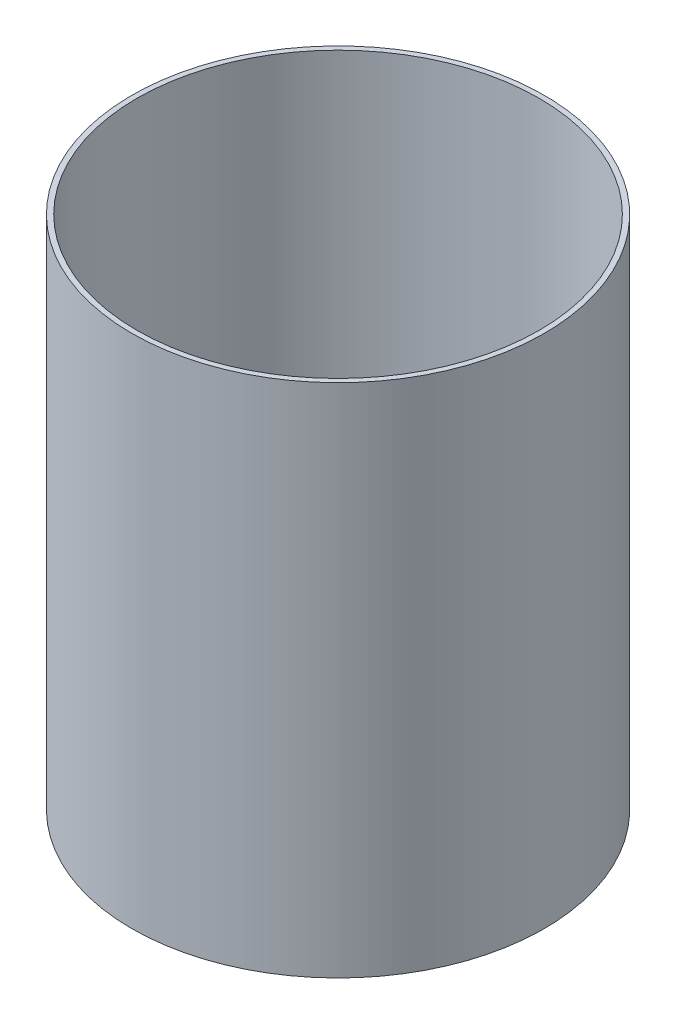
ISO-10303-21;
HEADER;
FILE_DESCRIPTION(('STEP AP214'),'2;1');
FILE_NAME('part.step','',(''),(''),'','','');
FILE_SCHEMA(('AUTOMOTIVE_DESIGN { 1 0 10303 214 1 1 1 1 }'));
ENDSEC;
DATA;
#1=APPLICATION_CONTEXT('core data for automotive mechanical design processes');
#2=APPLICATION_PROTOCOL_DEFINITION('international standard','automotive_design',2000,#1);
#3=PRODUCT_CONTEXT('',#1,'mechanical');
#4=PRODUCT('Part','Part','',(#3));
#5=PRODUCT_RELATED_PRODUCT_CATEGORY('part','',(#4));
#6=PRODUCT_DEFINITION_FORMATION('','',#4);
#7=PRODUCT_DEFINITION_CONTEXT('part definition',#1,'design');
#8=PRODUCT_DEFINITION('design','',#6,#7);
#9=PRODUCT_DEFINITION_SHAPE('','',#8);
#10=(LENGTH_UNIT() NAMED_UNIT(*) SI_UNIT(.MILLI.,.METRE.));
#11=(NAMED_UNIT(*) PLANE_ANGLE_UNIT() SI_UNIT($,.RADIAN.));
#12=(NAMED_UNIT(*) SI_UNIT($,.STERADIAN.) SOLID_ANGLE_UNIT());
#13=UNCERTAINTY_MEASURE_WITH_UNIT(LENGTH_MEASURE(1.E-05),#10,'distance_accuracy_value','');
#14=(GEOMETRIC_REPRESENTATION_CONTEXT(3) GLOBAL_UNCERTAINTY_ASSIGNED_CONTEXT((#13)) GLOBAL_UNIT_ASSIGNED_CONTEXT((#10,
#11,#12)) REPRESENTATION_CONTEXT('',''));
#15=CARTESIAN_POINT('',(0.,0.,0.));
#16=DIRECTION('',(0.,0.,1.));
#17=DIRECTION('',(1.,0.,0.));
#18=AXIS2_PLACEMENT_3D('',#15,#16,#17);
#19=CARTESIAN_POINT('',(0.,254.,0.));
#20=DIRECTION('',(0.,1.,0.));
#21=DIRECTION('',(0.,0.,1.));
#22=AXIS2_PLACEMENT_3D('',#19,#20,#21);
#23=PLANE('',#22);
#24=CARTESIAN_POINT('',(0.,254.,0.));
#25=DIRECTION('',(0.,1.,0.));
#26=DIRECTION('',(0.,0.,1.));
#27=AXIS2_PLACEMENT_3D('',#24,#25,#26);
#28=CIRCLE('',#27,101.6);
#29=CARTESIAN_POINT('',(0.,254.,101.6));
#30=VERTEX_POINT('',#29);
#31=EDGE_CURVE('E10',#30,#30,#28,.T.);
#32=ORIENTED_EDGE('',*,*,#31,.T.);
#33=EDGE_LOOP('',(#32));
#34=FACE_BOUND('',#33,.T.);
#35=CARTESIAN_POINT('',(0.,254.,0.));
#36=DIRECTION('',(0.,1.,0.));
#37=DIRECTION('',(0.,0.,1.));
#38=AXIS2_PLACEMENT_3D('',#35,#36,#37);
#39=CIRCLE('',#38,99.06);
#40=CARTESIAN_POINT('',(0.,254.,99.06));
#41=VERTEX_POINT('',#40);
#42=EDGE_CURVE('E50',#41,#41,#39,.T.);
#43=ORIENTED_EDGE('',*,*,#42,.F.);
#44=EDGE_LOOP('',(#43));
#45=FACE_BOUND('',#44,.T.);
#46=ADVANCED_FACE('F37',(#34,#45),#23,.T.);
#47=CARTESIAN_POINT('',(0.,0.,0.));
#48=DIRECTION('',(0.,1.,0.));
#49=DIRECTION('',(0.,0.,1.));
#50=AXIS2_PLACEMENT_3D('',#47,#48,#49);
#51=PLANE('',#50);
#52=CARTESIAN_POINT('',(0.,0.,0.));
#53=DIRECTION('',(0.,1.,0.));
#54=DIRECTION('',(0.,0.,1.));
#55=AXIS2_PLACEMENT_3D('',#52,#53,#54);
#56=CIRCLE('',#55,101.6);
#57=CARTESIAN_POINT('',(0.,0.,101.6));
#58=VERTEX_POINT('',#57);
#59=EDGE_CURVE('E41',#58,#58,#56,.T.);
#60=ORIENTED_EDGE('',*,*,#59,.F.);
#61=EDGE_LOOP('',(#60));
#62=FACE_BOUND('',#61,.T.);
#63=CARTESIAN_POINT('',(0.,0.,0.));
#64=DIRECTION('',(0.,1.,0.));
#65=DIRECTION('',(0.,0.,1.));
#66=AXIS2_PLACEMENT_3D('',#63,#64,#65);
#67=CIRCLE('',#66,99.06);
#68=CARTESIAN_POINT('',(0.,0.,99.06));
#69=VERTEX_POINT('',#68);
#70=EDGE_CURVE('E52',#69,#69,#67,.T.);
#71=ORIENTED_EDGE('',*,*,#70,.T.);
#72=EDGE_LOOP('',(#71));
#73=FACE_BOUND('',#72,.T.);
#74=ADVANCED_FACE('F64',(#62,#73),#51,.F.);
#75=CARTESIAN_POINT('',(0.,254.,0.));
#76=DIRECTION('',(0.,-1.,0.));
#77=DIRECTION('',(0.,0.,-1.));
#78=AXIS2_PLACEMENT_3D('',#75,#76,#77);
#79=CYLINDRICAL_SURFACE('',#78,101.6);
#80=ORIENTED_EDGE('',*,*,#31,.F.);
#81=EDGE_LOOP('',(#80));
#82=FACE_BOUND('',#81,.T.);
#83=ORIENTED_EDGE('',*,*,#59,.T.);
#84=EDGE_LOOP('',(#83));
#85=FACE_BOUND('',#84,.T.);
#86=ADVANCED_FACE('F39',(#82,#85),#79,.T.);
#87=CARTESIAN_POINT('',(0.,254.,0.));
#88=DIRECTION('',(0.,-1.,0.));
#89=DIRECTION('',(0.,0.,-1.));
#90=AXIS2_PLACEMENT_3D('',#87,#88,#89);
#91=CYLINDRICAL_SURFACE('',#90,99.06);
#92=ORIENTED_EDGE('',*,*,#42,.T.);
#93=EDGE_LOOP('',(#92));
#94=FACE_BOUND('',#93,.T.);
#95=ORIENTED_EDGE('',*,*,#70,.F.);
#96=EDGE_LOOP('',(#95));
#97=FACE_BOUND('',#96,.T.);
#98=ADVANCED_FACE('F60',(#94,#97),#91,.F.);
#99=CLOSED_SHELL('',(#46,#74,#86,#98));
#100=MANIFOLD_SOLID_BREP('B2',#99);
#101=ADVANCED_BREP_SHAPE_REPRESENTATION('',(#18,#100),#14);
#102=SHAPE_DEFINITION_REPRESENTATION(#9,#101);
ENDSEC;
END-ISO-10303-21;
